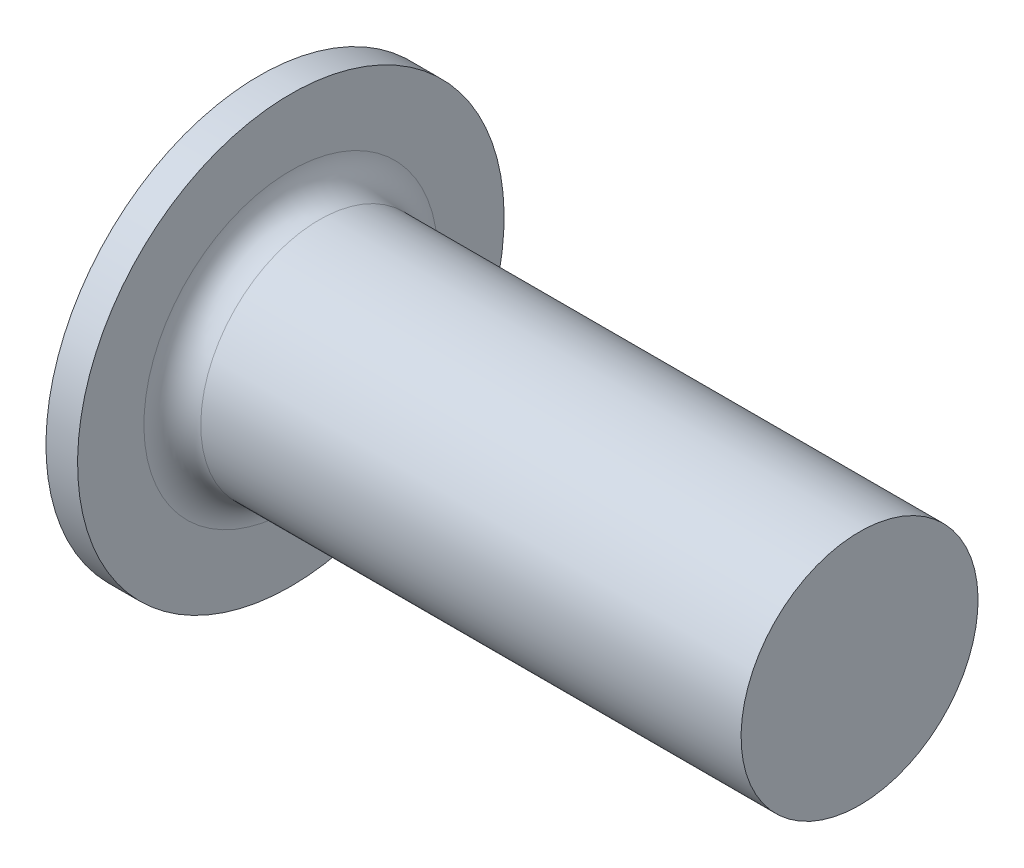
ISO-10303-21;
HEADER;
FILE_DESCRIPTION(('STEP AP214'),'2;1');
FILE_NAME('part.step','',(''),(''),'','','');
FILE_SCHEMA(('AUTOMOTIVE_DESIGN { 1 0 10303 214 1 1 1 1 }'));
ENDSEC;
DATA;
#1=APPLICATION_CONTEXT('core data for automotive mechanical design processes');
#2=APPLICATION_PROTOCOL_DEFINITION('international standard','automotive_design',2000,#1);
#3=PRODUCT_CONTEXT('',#1,'mechanical');
#4=PRODUCT('Part','Part','',(#3));
#5=PRODUCT_RELATED_PRODUCT_CATEGORY('part','',(#4));
#6=PRODUCT_DEFINITION_FORMATION('','',#4);
#7=PRODUCT_DEFINITION_CONTEXT('part definition',#1,'design');
#8=PRODUCT_DEFINITION('design','',#6,#7);
#9=PRODUCT_DEFINITION_SHAPE('','',#8);
#10=(LENGTH_UNIT() NAMED_UNIT(*) SI_UNIT(.MILLI.,.METRE.));
#11=(NAMED_UNIT(*) PLANE_ANGLE_UNIT() SI_UNIT($,.RADIAN.));
#12=(NAMED_UNIT(*) SI_UNIT($,.STERADIAN.) SOLID_ANGLE_UNIT());
#13=UNCERTAINTY_MEASURE_WITH_UNIT(LENGTH_MEASURE(1.E-05),#10,'distance_accuracy_value','');
#14=(GEOMETRIC_REPRESENTATION_CONTEXT(3) GLOBAL_UNCERTAINTY_ASSIGNED_CONTEXT((#13)) GLOBAL_UNIT_ASSIGNED_CONTEXT((#10,
#11,#12)) REPRESENTATION_CONTEXT('',''));
#15=CARTESIAN_POINT('',(0.,0.,0.));
#16=DIRECTION('',(0.,0.,1.));
#17=DIRECTION('',(1.,0.,0.));
#18=AXIS2_PLACEMENT_3D('',#15,#16,#17);
#19=CARTESIAN_POINT('',(-1.,-8.1601392309949E-12,-2.06362704702201E-11));
#20=DIRECTION('',(1.00000000000015,0.,0.));
#21=DIRECTION('',(0.,1.00000000000032,0.));
#22=AXIS2_PLACEMENT_3D('',#19,#20,#21);
#23=PLANE('',#22);
#24=CARTESIAN_POINT('',(-1.,-8.1601392309949E-12,-2.06362704702201E-11));
#25=DIRECTION('',(-1.00000000000015,0.,0.));
#26=DIRECTION('',(0.,-1.00000000000032,0.));
#27=AXIS2_PLACEMENT_3D('',#24,#25,#26);
#28=CIRCLE('',#27,3.92264973081038);
#29=CARTESIAN_POINT('',(-0.999999999999773,-3.92264973081978,-2.0730992069279E-11));
#30=VERTEX_POINT('',#29);
#31=EDGE_CURVE('E246',#30,#30,#28,.T.);
#32=ORIENTED_EDGE('',*,*,#31,.T.);
#33=EDGE_LOOP('',(#32));
#34=FACE_BOUND('',#33,.T.);
#35=CARTESIAN_POINT('',(-1.00000000000219,1.34625624390655,0.777261404798613));
#36=DIRECTION('',(-1.00000000000015,0.,0.));
#37=DIRECTION('',(0.,0.,-1.00000000000033));
#38=AXIS2_PLACEMENT_3D('',#35,#36,#37);
#39=CIRCLE('',#38,0.52952280964857);
#40=CARTESIAN_POINT('',(-0.999999999999945,1.19825813866664,0.268841335585801));
#41=VERTEX_POINT('',#40);
#42=CARTESIAN_POINT('',(-1.00000000000061,0.831952495555288,0.903301320557492));
#43=VERTEX_POINT('',#42);
#44=EDGE_CURVE('E56',#41,#43,#39,.T.);
#45=ORIENTED_EDGE('',*,*,#44,.T.);
#46=CARTESIAN_POINT('',(-1.,0.559999999992344,0.969948452208436));
#47=DIRECTION('',(1.00000000000015,0.,0.));
#48=DIRECTION('',(0.,0.,-1.00000000000033));
#49=AXIS2_PLACEMENT_3D('',#46,#47,#48);
#50=CIRCLE('',#49,0.279999999999998);
#51=CARTESIAN_POINT('',(-1.00000000000297,0.366305643109077,1.17214265615972));
#52=VERTEX_POINT('',#51);
#53=EDGE_CURVE('E170',#43,#52,#50,.T.);
#54=ORIENTED_EDGE('',*,*,#53,.T.);
#55=CARTESIAN_POINT('',(-1.00000000000114,-1.11577413974828E-11,1.55452280962376));
#56=DIRECTION('',(-1.00000000000015,0.,0.));
#57=DIRECTION('',(0.,0.,-1.00000000000033));
#58=AXIS2_PLACEMENT_3D('',#55,#56,#57);
#59=CIRCLE('',#58,0.529522809648569);
#60=CARTESIAN_POINT('',(-1.00000000000158,-0.366305643123954,1.17214265616007));
#61=VERTEX_POINT('',#60);
#62=EDGE_CURVE('E174',#52,#61,#59,.T.);
#63=ORIENTED_EDGE('',*,*,#62,.T.);
#64=CARTESIAN_POINT('',(-0.999999999998613,-0.560000000001393,0.969948452213876));
#65=DIRECTION('',(1.00000000000015,0.,0.));
#66=DIRECTION('',(0.,0.,-1.00000000000033));
#67=AXIS2_PLACEMENT_3D('',#64,#65,#66);
#68=CIRCLE('',#67,0.280000000000001);
#69=CARTESIAN_POINT('',(-0.999999999997031,-0.831952495560784,0.903301320556604));
#70=VERTEX_POINT('',#69);
#71=EDGE_CURVE('E178',#61,#70,#68,.T.);
#72=ORIENTED_EDGE('',*,*,#71,.T.);
#73=CARTESIAN_POINT('',(-1.0000000000033,-1.34625624392515,0.777261404804067));
#74=DIRECTION('',(-1.00000000000015,0.,0.));
#75=DIRECTION('',(0.,0.,-1.00000000000033));
#76=AXIS2_PLACEMENT_3D('',#73,#74,#75);
#77=CIRCLE('',#76,0.529522809648555);
#78=CARTESIAN_POINT('',(-0.999999999999973,-1.19825813868779,0.268841335581929));
#79=VERTEX_POINT('',#78);
#80=EDGE_CURVE('E182',#70,#79,#77,.T.);
#81=ORIENTED_EDGE('',*,*,#80,.T.);
#82=CARTESIAN_POINT('',(-1.00000000000131,-1.1200000000105,-2.35228503342455E-11));
#83=DIRECTION('',(1.00000000000015,0.,0.));
#84=DIRECTION('',(0.,0.,-1.00000000000033));
#85=AXIS2_PLACEMENT_3D('',#82,#83,#84);
#86=CIRCLE('',#85,0.280000000000001);
#87=CARTESIAN_POINT('',(-0.999999999999973,-1.19825813868879,-0.26884133563175));
#88=VERTEX_POINT('',#87);
#89=EDGE_CURVE('E186',#79,#88,#86,.T.);
#90=ORIENTED_EDGE('',*,*,#89,.T.);
#91=CARTESIAN_POINT('',(-0.999999999998447,-1.34625624392826,-0.777261404845242));
#92=DIRECTION('',(-1.00000000000015,0.,0.));
#93=DIRECTION('',(0.,0.,-1.00000000000033));
#94=AXIS2_PLACEMENT_3D('',#91,#92,#93);
#95=CIRCLE('',#94,0.52952280964857);
#96=CARTESIAN_POINT('',(-0.999999999997669,-0.831952495560284,-0.903301320603886));
#97=VERTEX_POINT('',#96);
#98=EDGE_CURVE('E190',#88,#97,#95,.T.);
#99=ORIENTED_EDGE('',*,*,#98,.T.);
#100=CARTESIAN_POINT('',(-1.00000000000081,-0.559999999996896,-0.969948452267819));
#101=DIRECTION('',(1.00000000000015,0.,0.));
#102=DIRECTION('',(0.,0.,-1.00000000000033));
#103=AXIS2_PLACEMENT_3D('',#100,#101,#102);
#104=CIRCLE('',#103,0.279999999999997);
#105=CARTESIAN_POINT('',(-0.999999999997475,-0.366305643114129,-1.17214265621168));
#106=VERTEX_POINT('',#105);
#107=EDGE_CURVE('E194',#97,#106,#104,.T.);
#108=ORIENTED_EDGE('',*,*,#107,.T.);
#109=CARTESIAN_POINT('',(-0.999999999999834,-4.16333634234434E-12,-1.55452280965729));
#110=DIRECTION('',(-1.00000000000015,0.,0.));
#111=DIRECTION('',(0.,0.,-1.00000000000033));
#112=AXIS2_PLACEMENT_3D('',#109,#110,#111);
#113=CIRCLE('',#112,0.529522809648569);
#114=CARTESIAN_POINT('',(-1.00000000000081,0.366305643104081,-1.17214265620667));
#115=VERTEX_POINT('',#114);
#116=EDGE_CURVE('E198',#106,#115,#113,.T.);
#117=ORIENTED_EDGE('',*,*,#116,.T.);
#118=CARTESIAN_POINT('',(-1.00000000000081,0.559999999994787,-0.969948452265931));
#119=DIRECTION('',(1.00000000000015,0.,0.));
#120=DIRECTION('',(0.,0.,-1.00000000000033));
#121=AXIS2_PLACEMENT_3D('',#118,#119,#120);
#122=CIRCLE('',#121,0.28);
#123=CARTESIAN_POINT('',(-1.00000000000081,0.831952495554567,-0.903301320593575));
#124=VERTEX_POINT('',#123);
#125=EDGE_CURVE('E202',#115,#124,#122,.T.);
#126=ORIENTED_EDGE('',*,*,#125,.T.);
#127=CARTESIAN_POINT('',(-0.999999999998863,1.34625624390894,-0.777261404845686));
#128=DIRECTION('',(-1.00000000000015,0.,0.));
#129=DIRECTION('',(0.,0.,-1.00000000000033));
#130=AXIS2_PLACEMENT_3D('',#127,#128,#129);
#131=CIRCLE('',#130,0.529522809648569);
#132=CARTESIAN_POINT('',(-0.999999999999945,1.19825813866897,-0.268841335635095));
#133=VERTEX_POINT('',#132);
#134=EDGE_CURVE('E155',#124,#133,#131,.T.);
#135=ORIENTED_EDGE('',*,*,#134,.T.);
#136=CARTESIAN_POINT('',(-0.999999999999945,1.11999999998991,-2.55212517785708E-11));
#137=DIRECTION('',(1.00000000000015,0.,0.));
#138=DIRECTION('',(0.,0.,-1.00000000000033));
#139=AXIS2_PLACEMENT_3D('',#136,#137,#138);
#140=CIRCLE('',#139,0.28);
#141=EDGE_CURVE('E207',#133,#41,#140,.T.);
#142=ORIENTED_EDGE('',*,*,#141,.T.);
#143=EDGE_LOOP('',(#45,#54,#63,#72,#81,#90,#99,#108,#117,#126,#135,#142));
#144=FACE_BOUND('',#143,.T.);
#145=ADVANCED_FACE('F40',(#34,#144),#23,.F.);
#146=CARTESIAN_POINT('',(-3.1641356201817E-12,4.49999999998896,-2.08583150751451E-11));
#147=DIRECTION('',(-1.00000000000015,0.,0.));
#148=DIRECTION('',(0.,-1.00000000000032,0.));
#149=AXIS2_PLACEMENT_3D('',#146,#147,#148);
#150=PLANE('',#149);
#151=CARTESIAN_POINT('',(0.,0.,0.));
#152=DIRECTION('',(-1.00000000000015,0.,0.));
#153=DIRECTION('',(0.,-1.00000000000032,0.));
#154=AXIS2_PLACEMENT_3D('',#151,#152,#153);
#155=CIRCLE('',#154,3.1);
#156=CARTESIAN_POINT('',(1.79906282495688E-13,-3.10000000000098,0.));
#157=VERTEX_POINT('',#156);
#158=EDGE_CURVE('E49',#157,#157,#155,.T.);
#159=ORIENTED_EDGE('',*,*,#158,.T.);
#160=EDGE_LOOP('',(#159));
#161=FACE_BOUND('',#160,.T.);
#162=CARTESIAN_POINT('',(0.,0.,0.));
#163=DIRECTION('',(-1.00000000000015,0.,0.));
#164=DIRECTION('',(0.,-1.00000000000032,0.));
#165=AXIS2_PLACEMENT_3D('',#162,#163,#164);
#166=CIRCLE('',#165,4.5);
#167=CARTESIAN_POINT('',(2.61154281042128E-13,-4.50000000000143,-1.08663078535187E-13));
#168=VERTEX_POINT('',#167);
#169=EDGE_CURVE('E254',#168,#168,#166,.T.);
#170=ORIENTED_EDGE('',*,*,#169,.F.);
#171=EDGE_LOOP('',(#170));
#172=FACE_BOUND('',#171,.T.);
#173=ADVANCED_FACE('F262',(#161,#172),#150,.F.);
#174=CARTESIAN_POINT('',(-1.,-8.1601392309949E-12,-2.06362704702201E-11));
#175=DIRECTION('',(-1.00000000000015,0.,0.));
#176=DIRECTION('',(0.,-1.00000000000032,0.));
#177=AXIS2_PLACEMENT_3D('',#174,#175,#176);
#178=CYLINDRICAL_SURFACE('',#177,4.5);
#179=CARTESIAN_POINT('',(-0.666666666666649,0.,0.));
#180=DIRECTION('',(-1.00000000000015,0.,0.));
#181=DIRECTION('',(0.,-1.00000000000032,0.));
#182=AXIS2_PLACEMENT_3D('',#179,#180,#181);
#183=CIRCLE('',#182,4.5);
#184=CARTESIAN_POINT('',(-0.666666666666388,-4.50000000000143,-1.08663078535187E-13));
#185=VERTEX_POINT('',#184);
#186=EDGE_CURVE('E250',#185,#185,#183,.T.);
#187=ORIENTED_EDGE('',*,*,#186,.F.);
#188=EDGE_LOOP('',(#187));
#189=FACE_BOUND('',#188,.T.);
#190=ORIENTED_EDGE('',*,*,#169,.T.);
#191=EDGE_LOOP('',(#190));
#192=FACE_BOUND('',#191,.T.);
#193=ADVANCED_FACE('F279',(#189,#192),#178,.T.);
#194=CARTESIAN_POINT('',(-0.666666666666649,0.,0.));
#195=DIRECTION('',(1.00000000000015,0.,0.));
#196=DIRECTION('',(0.,1.00000000000032,0.));
#197=AXIS2_PLACEMENT_3D('',#194,#195,#196);
#198=CONICAL_SURFACE('',#197,4.5,1.0471975511966);
#199=ORIENTED_EDGE('',*,*,#31,.F.);
#200=EDGE_LOOP('',(#199));
#201=FACE_BOUND('',#200,.T.);
#202=ORIENTED_EDGE('',*,*,#186,.T.);
#203=EDGE_LOOP('',(#202));
#204=FACE_BOUND('',#203,.T.);
#205=ADVANCED_FACE('F285',(#201,#204),#198,.T.);
#206=CARTESIAN_POINT('',(12.0000000000054,2.49999999999412,-6.66133814775094E-12));
#207=DIRECTION('',(-1.00000000000015,0.,0.));
#208=DIRECTION('',(0.,-1.00000000000032,0.));
#209=AXIS2_PLACEMENT_3D('',#206,#207,#208);
#210=PLANE('',#209);
#211=CARTESIAN_POINT('',(12.0000000000042,-8.88178419700125E-12,-1.64313007644523E-11));
#212=DIRECTION('',(-1.00000000000015,0.,0.));
#213=DIRECTION('',(0.,-1.00000000000032,0.));
#214=AXIS2_PLACEMENT_3D('',#211,#212,#213);
#215=CIRCLE('',#214,2.5);
#216=CARTESIAN_POINT('',(12.0000000000043,-2.50000000000967,-1.64916691414163E-11));
#217=VERTEX_POINT('',#216);
#218=EDGE_CURVE('E242',#217,#217,#215,.T.);
#219=ORIENTED_EDGE('',*,*,#218,.F.);
#220=EDGE_LOOP('',(#219));
#221=FACE_BOUND('',#220,.T.);
#222=ADVANCED_FACE('F283',(#221),#210,.F.);
#223=CARTESIAN_POINT('',(-1.,-8.1601392309949E-12,-2.06362704702201E-11));
#224=DIRECTION('',(-1.00000000000015,0.,0.));
#225=DIRECTION('',(0.,-1.00000000000032,0.));
#226=AXIS2_PLACEMENT_3D('',#223,#224,#225);
#227=CYLINDRICAL_SURFACE('',#226,2.5);
#228=CARTESIAN_POINT('',(0.599999999999989,-7.16093850883226E-12,-1.65423230669148E-11));
#229=DIRECTION('',(-1.00000000000015,0.,0.));
#230=DIRECTION('',(0.,-1.00000000000032,0.));
#231=AXIS2_PLACEMENT_3D('',#228,#229,#230);
#232=CIRCLE('',#231,2.5);
#233=CARTESIAN_POINT('',(0.600000000000135,-2.50000000000795,-1.66026914438788E-11));
#234=VERTEX_POINT('',#233);
#235=EDGE_CURVE('E11',#234,#234,#232,.F.);
#236=ORIENTED_EDGE('',*,*,#235,.T.);
#237=EDGE_LOOP('',(#236));
#238=FACE_BOUND('',#237,.T.);
#239=ORIENTED_EDGE('',*,*,#218,.T.);
#240=EDGE_LOOP('',(#239));
#241=FACE_BOUND('',#240,.T.);
#242=ADVANCED_FACE('F309',(#238,#241),#227,.T.);
#243=CARTESIAN_POINT('',(-2.19269047363468E-12,1.346256243907,0.777261404799293));
#244=DIRECTION('',(-1.00000000000015,0.,0.));
#245=DIRECTION('',(0.,0.,1.00000000000033));
#246=AXIS2_PLACEMENT_3D('',#243,#244,#245);
#247=CYLINDRICAL_SURFACE('',#246,0.52952280964857);
#248=ORIENTED_EDGE('',*,*,#44,.F.);
#249=DIRECTION('',(-1.00000000000015,0.,0.));
#250=VECTOR('',#249,1.);
#251=CARTESIAN_POINT('',(-6.10622663543836E-13,1.19825813866953,0.26884133559113));
#252=LINE('',#251,#250);
#253=CARTESIAN_POINT('',(-6.10622663543836E-13,1.19825813866953,0.26884133559113));
#254=VERTEX_POINT('',#253);
#255=EDGE_CURVE('E164',#254,#41,#252,.T.);
#256=ORIENTED_EDGE('',*,*,#255,.F.);
#257=CARTESIAN_POINT('',(-2.19269047363468E-12,1.346256243907,0.777261404799293));
#258=DIRECTION('',(-1.00000000000015,0.,0.));
#259=DIRECTION('',(0.,0.,-1.00000000000033));
#260=AXIS2_PLACEMENT_3D('',#257,#258,#259);
#261=CIRCLE('',#260,0.52952280964857);
#262=CARTESIAN_POINT('',(-6.10622663543836E-13,0.831952495556176,0.90330132055827));
#263=VERTEX_POINT('',#262);
#264=EDGE_CURVE('E211',#254,#263,#261,.T.);
#265=ORIENTED_EDGE('',*,*,#264,.T.);
#266=DIRECTION('',(-1.00000000000015,0.,0.));
#267=VECTOR('',#266,1.);
#268=CARTESIAN_POINT('',(-6.10622663543836E-13,0.831952495556176,0.90330132055827));
#269=LINE('',#268,#267);
#270=EDGE_CURVE('E239',#263,#43,#269,.T.);
#271=ORIENTED_EDGE('',*,*,#270,.T.);
#272=EDGE_LOOP('',(#248,#256,#265,#271));
#273=FACE_BOUND('',#272,.T.);
#274=ADVANCED_FACE('F316',(#273),#247,.T.);
#275=CARTESIAN_POINT('',(0.,0.559999999993122,0.969948452212335));
#276=DIRECTION('',(-1.00000000000015,0.,0.));
#277=DIRECTION('',(0.,0.,1.00000000000033));
#278=AXIS2_PLACEMENT_3D('',#275,#276,#277);
#279=CYLINDRICAL_SURFACE('',#278,0.279999999999998);
#280=ORIENTED_EDGE('',*,*,#53,.F.);
#281=ORIENTED_EDGE('',*,*,#270,.F.);
#282=CARTESIAN_POINT('',(0.,0.559999999993122,0.969948452212335));
#283=DIRECTION('',(1.00000000000015,0.,0.));
#284=DIRECTION('',(0.,0.,-1.00000000000033));
#285=AXIS2_PLACEMENT_3D('',#282,#283,#284);
#286=CIRCLE('',#285,0.279999999999998);
#287=CARTESIAN_POINT('',(-2.96984659087229E-12,0.36630564310719,1.17214265616206));
#288=VERTEX_POINT('',#287);
#289=EDGE_CURVE('E113',#263,#288,#286,.T.);
#290=ORIENTED_EDGE('',*,*,#289,.T.);
#291=DIRECTION('',(-1.00000000000015,0.,0.));
#292=VECTOR('',#291,1.);
#293=CARTESIAN_POINT('',(-2.96984659087229E-12,0.36630564310719,1.17214265616206));
#294=LINE('',#293,#292);
#295=EDGE_CURVE('E236',#288,#52,#294,.T.);
#296=ORIENTED_EDGE('',*,*,#295,.T.);
#297=EDGE_LOOP('',(#280,#281,#290,#296));
#298=FACE_BOUND('',#297,.T.);
#299=ADVANCED_FACE('F323',(#298),#279,.F.);
#300=CARTESIAN_POINT('',(-1.13797860024079E-12,-1.14908083048704E-11,1.55452280962454));
#301=DIRECTION('',(-1.00000000000015,0.,0.));
#302=DIRECTION('',(0.,0.,1.00000000000033));
#303=AXIS2_PLACEMENT_3D('',#300,#301,#302);
#304=CYLINDRICAL_SURFACE('',#303,0.529522809648569);
#305=ORIENTED_EDGE('',*,*,#62,.F.);
#306=ORIENTED_EDGE('',*,*,#295,.F.);
#307=CARTESIAN_POINT('',(-1.13797860024079E-12,-1.14908083048704E-11,1.55452280962454));
#308=DIRECTION('',(-1.00000000000015,0.,0.));
#309=DIRECTION('',(0.,0.,-1.00000000000033));
#310=AXIS2_PLACEMENT_3D('',#307,#308,#309);
#311=CIRCLE('',#310,0.529522809648569);
#312=CARTESIAN_POINT('',(-1.58206781009085E-12,-0.366305643122788,1.17214265616183));
#313=VERTEX_POINT('',#312);
#314=EDGE_CURVE('E492',#288,#313,#311,.T.);
#315=ORIENTED_EDGE('',*,*,#314,.T.);
#316=DIRECTION('',(-1.00000000000015,0.,0.));
#317=VECTOR('',#316,1.);
#318=CARTESIAN_POINT('',(-1.58206781009085E-12,-0.366305643122788,1.17214265616183));
#319=LINE('',#318,#317);
#320=EDGE_CURVE('E233',#313,#61,#319,.T.);
#321=ORIENTED_EDGE('',*,*,#320,.T.);
#322=EDGE_LOOP('',(#305,#306,#315,#321));
#323=FACE_BOUND('',#322,.T.);
#324=ADVANCED_FACE('F330',(#323),#304,.T.);
#325=CARTESIAN_POINT('',(1.38777878078145E-12,-0.56000000000106,0.969948452216207));
#326=DIRECTION('',(-1.00000000000015,0.,0.));
#327=DIRECTION('',(0.,0.,1.00000000000033));
#328=AXIS2_PLACEMENT_3D('',#325,#326,#327);
#329=CYLINDRICAL_SURFACE('',#328,0.280000000000001);
#330=ORIENTED_EDGE('',*,*,#71,.F.);
#331=ORIENTED_EDGE('',*,*,#320,.F.);
#332=CARTESIAN_POINT('',(1.38777878078145E-12,-0.56000000000106,0.969948452216207));
#333=DIRECTION('',(1.00000000000015,0.,0.));
#334=DIRECTION('',(0.,0.,-1.00000000000033));
#335=AXIS2_PLACEMENT_3D('',#332,#333,#334);
#336=CIRCLE('',#335,0.280000000000001);
#337=CARTESIAN_POINT('',(2.96984659087229E-12,-0.831952495565058,0.903301320555175));
#338=VERTEX_POINT('',#337);
#339=EDGE_CURVE('E489',#313,#338,#336,.T.);
#340=ORIENTED_EDGE('',*,*,#339,.T.);
#341=DIRECTION('',(-1.00000000000015,0.,0.));
#342=VECTOR('',#341,1.);
#343=CARTESIAN_POINT('',(2.96984659087229E-12,-0.831952495565058,0.903301320555175));
#344=LINE('',#343,#342);
#345=EDGE_CURVE('E230',#338,#70,#344,.T.);
#346=ORIENTED_EDGE('',*,*,#345,.T.);
#347=EDGE_LOOP('',(#330,#331,#340,#346));
#348=FACE_BOUND('',#347,.T.);
#349=ADVANCED_FACE('F338',(#348),#329,.F.);
#350=CARTESIAN_POINT('',(-3.30291349825984E-12,-1.34625624392365,0.777261404798169));
#351=DIRECTION('',(-1.00000000000015,0.,0.));
#352=DIRECTION('',(0.,0.,1.00000000000033));
#353=AXIS2_PLACEMENT_3D('',#350,#351,#352);
#354=CYLINDRICAL_SURFACE('',#353,0.529522809648555);
#355=ORIENTED_EDGE('',*,*,#80,.F.);
#356=ORIENTED_EDGE('',*,*,#345,.F.);
#357=CARTESIAN_POINT('',(-3.30291349825984E-12,-1.34625624392365,0.777261404798169));
#358=DIRECTION('',(-1.00000000000015,0.,0.));
#359=DIRECTION('',(0.,0.,-1.00000000000033));
#360=AXIS2_PLACEMENT_3D('',#357,#358,#359);
#361=CIRCLE('',#360,0.529522809648555);
#362=CARTESIAN_POINT('',(-2.35922392732846E-12,-1.19825813869001,0.268841335581027));
#363=VERTEX_POINT('',#362);
#364=EDGE_CURVE('E486',#338,#363,#361,.T.);
#365=ORIENTED_EDGE('',*,*,#364,.T.);
#366=DIRECTION('',(-1.00000000000015,0.,0.));
#367=VECTOR('',#366,1.);
#368=CARTESIAN_POINT('',(-2.35922392732846E-12,-1.19825813869001,0.268841335581027));
#369=LINE('',#368,#367);
#370=EDGE_CURVE('E227',#363,#79,#369,.T.);
#371=ORIENTED_EDGE('',*,*,#370,.T.);
#372=EDGE_LOOP('',(#355,#356,#365,#371));
#373=FACE_BOUND('',#372,.T.);
#374=ADVANCED_FACE('F346',(#373),#354,.T.);
#375=CARTESIAN_POINT('',(-2.35922392732846E-12,-1.12000000001078,-2.25375273998907E-11));
#376=DIRECTION('',(-1.00000000000015,0.,0.));
#377=DIRECTION('',(0.,0.,1.00000000000033));
#378=AXIS2_PLACEMENT_3D('',#375,#376,#377);
#379=CYLINDRICAL_SURFACE('',#378,0.280000000000001);
#380=ORIENTED_EDGE('',*,*,#89,.F.);
#381=ORIENTED_EDGE('',*,*,#370,.F.);
#382=CARTESIAN_POINT('',(-2.35922392732846E-12,-1.12000000001078,-2.25375273998907E-11));
#383=DIRECTION('',(1.00000000000015,0.,0.));
#384=DIRECTION('',(0.,0.,-1.00000000000033));
#385=AXIS2_PLACEMENT_3D('',#382,#383,#384);
#386=CIRCLE('',#385,0.280000000000001);
#387=CARTESIAN_POINT('',(5.82867087928207E-13,-1.19825813868712,-0.26884133563243));
#388=VERTEX_POINT('',#387);
#389=EDGE_CURVE('E483',#363,#388,#386,.T.);
#390=ORIENTED_EDGE('',*,*,#389,.T.);
#391=DIRECTION('',(-1.00000000000015,0.,0.));
#392=VECTOR('',#391,1.);
#393=CARTESIAN_POINT('',(5.82867087928207E-13,-1.19825813868712,-0.26884133563243));
#394=LINE('',#393,#392);
#395=EDGE_CURVE('E224',#388,#88,#394,.T.);
#396=ORIENTED_EDGE('',*,*,#395,.T.);
#397=EDGE_LOOP('',(#380,#381,#390,#396));
#398=FACE_BOUND('',#397,.T.);
#399=ADVANCED_FACE('F354',(#398),#379,.F.);
#400=CARTESIAN_POINT('',(1.55431223447522E-12,-1.34625624392931,-0.777261404844368));
#401=DIRECTION('',(-1.00000000000015,0.,0.));
#402=DIRECTION('',(0.,0.,1.00000000000033));
#403=AXIS2_PLACEMENT_3D('',#400,#401,#402);
#404=CYLINDRICAL_SURFACE('',#403,0.52952280964857);
#405=ORIENTED_EDGE('',*,*,#98,.F.);
#406=ORIENTED_EDGE('',*,*,#395,.F.);
#407=CARTESIAN_POINT('',(1.55431223447522E-12,-1.34625624392931,-0.777261404844368));
#408=DIRECTION('',(-1.00000000000015,0.,0.));
#409=DIRECTION('',(0.,0.,-1.00000000000033));
#410=AXIS2_PLACEMENT_3D('',#407,#408,#409);
#411=CIRCLE('',#410,0.52952280964857);
#412=CARTESIAN_POINT('',(2.33146835171283E-12,-0.831952495562616,-0.903301320602221));
#413=VERTEX_POINT('',#412);
#414=EDGE_CURVE('E478',#388,#413,#411,.T.);
#415=ORIENTED_EDGE('',*,*,#414,.T.);
#416=DIRECTION('',(-1.00000000000015,0.,0.));
#417=VECTOR('',#416,1.);
#418=CARTESIAN_POINT('',(2.33146835171283E-12,-0.831952495562616,-0.903301320602221));
#419=LINE('',#418,#417);
#420=EDGE_CURVE('E221',#413,#97,#419,.T.);
#421=ORIENTED_EDGE('',*,*,#420,.T.);
#422=EDGE_LOOP('',(#405,#406,#415,#421));
#423=FACE_BOUND('',#422,.T.);
#424=ADVANCED_FACE('F362',(#423),#404,.T.);
#425=CARTESIAN_POINT('',(-8.04911692853238E-13,-0.559999999997507,-0.969948452268721));
#426=DIRECTION('',(-1.00000000000015,0.,0.));
#427=DIRECTION('',(0.,0.,1.00000000000033));
#428=AXIS2_PLACEMENT_3D('',#425,#426,#427);
#429=CYLINDRICAL_SURFACE('',#428,0.279999999999997);
#430=ORIENTED_EDGE('',*,*,#107,.F.);
#431=ORIENTED_EDGE('',*,*,#420,.F.);
#432=CARTESIAN_POINT('',(-8.04911692853238E-13,-0.559999999997507,-0.969948452268721));
#433=DIRECTION('',(1.00000000000015,0.,0.));
#434=DIRECTION('',(0.,0.,-1.00000000000033));
#435=AXIS2_PLACEMENT_3D('',#432,#433,#434);
#436=CIRCLE('',#435,0.279999999999997);
#437=CARTESIAN_POINT('',(2.52575738102223E-12,-0.366305643115294,-1.17214265620856));
#438=VERTEX_POINT('',#437);
#439=EDGE_CURVE('E475',#413,#438,#436,.T.);
#440=ORIENTED_EDGE('',*,*,#439,.T.);
#441=DIRECTION('',(-1.00000000000015,0.,0.));
#442=VECTOR('',#441,1.);
#443=CARTESIAN_POINT('',(2.52575738102223E-12,-0.366305643115294,-1.17214265620856));
#444=LINE('',#443,#442);
#445=EDGE_CURVE('E218',#438,#106,#444,.T.);
#446=ORIENTED_EDGE('',*,*,#445,.T.);
#447=EDGE_LOOP('',(#430,#431,#440,#446));
#448=FACE_BOUND('',#447,.T.);
#449=ADVANCED_FACE('F370',(#448),#429,.F.);
#450=CARTESIAN_POINT('',(1.66533453693773E-13,-4.94049245958195E-12,-1.5545228096675));
#451=DIRECTION('',(-1.00000000000015,0.,0.));
#452=DIRECTION('',(0.,0.,1.00000000000033));
#453=AXIS2_PLACEMENT_3D('',#450,#451,#452);
#454=CYLINDRICAL_SURFACE('',#453,0.529522809648569);
#455=ORIENTED_EDGE('',*,*,#116,.F.);
#456=ORIENTED_EDGE('',*,*,#445,.F.);
#457=CARTESIAN_POINT('',(1.66533453693773E-13,-4.94049245958195E-12,-1.5545228096675));
#458=DIRECTION('',(-1.00000000000015,0.,0.));
#459=DIRECTION('',(0.,0.,-1.00000000000033));
#460=AXIS2_PLACEMENT_3D('',#457,#458,#459);
#461=CIRCLE('',#460,0.529522809648569);
#462=CARTESIAN_POINT('',(-8.04911692853238E-13,0.366305643102693,-1.17214265620724));
#463=VERTEX_POINT('',#462);
#464=EDGE_CURVE('E151',#438,#463,#461,.T.);
#465=ORIENTED_EDGE('',*,*,#464,.T.);
#466=DIRECTION('',(-1.00000000000015,0.,0.));
#467=VECTOR('',#466,1.);
#468=CARTESIAN_POINT('',(-8.04911692853238E-13,0.366305643102693,-1.17214265620724));
#469=LINE('',#468,#467);
#470=EDGE_CURVE('E146',#463,#115,#469,.T.);
#471=ORIENTED_EDGE('',*,*,#470,.T.);
#472=EDGE_LOOP('',(#455,#456,#465,#471));
#473=FACE_BOUND('',#472,.T.);
#474=ADVANCED_FACE('F378',(#473),#454,.T.);
#475=CARTESIAN_POINT('',(-8.04911692853238E-13,0.559999999995175,-0.969948452254843));
#476=DIRECTION('',(-1.00000000000015,0.,0.));
#477=DIRECTION('',(0.,0.,1.00000000000033));
#478=AXIS2_PLACEMENT_3D('',#475,#476,#477);
#479=CYLINDRICAL_SURFACE('',#478,0.28);
#480=ORIENTED_EDGE('',*,*,#125,.F.);
#481=ORIENTED_EDGE('',*,*,#470,.F.);
#482=CARTESIAN_POINT('',(-8.04911692853238E-13,0.559999999995175,-0.969948452254843));
#483=DIRECTION('',(1.00000000000015,0.,0.));
#484=DIRECTION('',(0.,0.,-1.00000000000033));
#485=AXIS2_PLACEMENT_3D('',#482,#483,#484);
#486=CIRCLE('',#485,0.28);
#487=CARTESIAN_POINT('',(-8.04911692853238E-13,0.831952495556454,-0.903301320602554));
#488=VERTEX_POINT('',#487);
#489=EDGE_CURVE('E141',#463,#488,#486,.T.);
#490=ORIENTED_EDGE('',*,*,#489,.T.);
#491=DIRECTION('',(-1.00000000000015,0.,0.));
#492=VECTOR('',#491,1.);
#493=CARTESIAN_POINT('',(-8.04911692853238E-13,0.831952495556454,-0.903301320602554));
#494=LINE('',#493,#492);
#495=EDGE_CURVE('E145',#488,#124,#494,.T.);
#496=ORIENTED_EDGE('',*,*,#495,.T.);
#497=EDGE_LOOP('',(#480,#481,#490,#496));
#498=FACE_BOUND('',#497,.T.);
#499=ADVANCED_FACE('F144',(#498),#479,.F.);
#500=CARTESIAN_POINT('',(1.13797860024079E-12,1.3462562439116,-0.777261404842466));
#501=DIRECTION('',(-1.00000000000015,0.,0.));
#502=DIRECTION('',(0.,0.,1.00000000000033));
#503=AXIS2_PLACEMENT_3D('',#500,#501,#502);
#504=CYLINDRICAL_SURFACE('',#503,0.529522809648569);
#505=ORIENTED_EDGE('',*,*,#134,.F.);
#506=ORIENTED_EDGE('',*,*,#495,.F.);
#507=CARTESIAN_POINT('',(1.13797860024079E-12,1.3462562439116,-0.777261404842466));
#508=DIRECTION('',(-1.00000000000015,0.,0.));
#509=DIRECTION('',(0.,0.,-1.00000000000033));
#510=AXIS2_PLACEMENT_3D('',#507,#508,#509);
#511=CIRCLE('',#510,0.529522809648569);
#512=CARTESIAN_POINT('',(1.66533453693773E-13,1.19825813866803,-0.268841335625755));
#513=VERTEX_POINT('',#512);
#514=EDGE_CURVE('E150',#488,#513,#511,.T.);
#515=ORIENTED_EDGE('',*,*,#514,.T.);
#516=DIRECTION('',(-1.00000000000015,0.,0.));
#517=VECTOR('',#516,1.);
#518=CARTESIAN_POINT('',(1.66533453693773E-13,1.19825813866803,-0.268841335625755));
#519=LINE('',#518,#517);
#520=EDGE_CURVE('E104',#513,#133,#519,.T.);
#521=ORIENTED_EDGE('',*,*,#520,.T.);
#522=EDGE_LOOP('',(#505,#506,#515,#521));
#523=FACE_BOUND('',#522,.T.);
#524=ADVANCED_FACE('F153',(#523),#504,.T.);
#525=CARTESIAN_POINT('',(2.52575738102223E-12,1.11999999999152,-2.75335310107039E-11));
#526=DIRECTION('',(-1.00000000000015,0.,0.));
#527=DIRECTION('',(0.,0.,1.00000000000033));
#528=AXIS2_PLACEMENT_3D('',#525,#526,#527);
#529=CYLINDRICAL_SURFACE('',#528,0.28);
#530=ORIENTED_EDGE('',*,*,#141,.F.);
#531=ORIENTED_EDGE('',*,*,#520,.F.);
#532=CARTESIAN_POINT('',(2.52575738102223E-12,1.11999999999152,-2.75335310107039E-11));
#533=DIRECTION('',(1.00000000000015,0.,0.));
#534=DIRECTION('',(0.,0.,-1.00000000000033));
#535=AXIS2_PLACEMENT_3D('',#532,#533,#534);
#536=CIRCLE('',#535,0.28);
#537=EDGE_CURVE('E64',#513,#254,#536,.T.);
#538=ORIENTED_EDGE('',*,*,#537,.T.);
#539=ORIENTED_EDGE('',*,*,#255,.T.);
#540=EDGE_LOOP('',(#530,#531,#538,#539));
#541=FACE_BOUND('',#540,.T.);
#542=ADVANCED_FACE('F270',(#541),#529,.F.);
#543=CARTESIAN_POINT('',(-6.10622663543836E-13,1.23312812195048,0.388630702392159));
#544=DIRECTION('',(1.00000000000015,0.,0.));
#545=DIRECTION('',(0.,0.,-1.00000000000033));
#546=AXIS2_PLACEMENT_3D('',#543,#544,#545);
#547=PLANE('',#546);
#548=ORIENTED_EDGE('',*,*,#264,.F.);
#549=ORIENTED_EDGE('',*,*,#537,.F.);
#550=ORIENTED_EDGE('',*,*,#514,.F.);
#551=ORIENTED_EDGE('',*,*,#489,.F.);
#552=ORIENTED_EDGE('',*,*,#464,.F.);
#553=ORIENTED_EDGE('',*,*,#439,.F.);
#554=ORIENTED_EDGE('',*,*,#414,.F.);
#555=ORIENTED_EDGE('',*,*,#389,.F.);
#556=ORIENTED_EDGE('',*,*,#364,.F.);
#557=ORIENTED_EDGE('',*,*,#339,.F.);
#558=ORIENTED_EDGE('',*,*,#314,.F.);
#559=ORIENTED_EDGE('',*,*,#289,.F.);
#560=EDGE_LOOP('',(#548,#549,#550,#551,#552,#553,#554,#555,#556,#557,#558,#559));
#561=FACE_BOUND('',#560,.T.);
#562=ADVANCED_FACE('F159',(#561),#547,.F.);
#563=CARTESIAN_POINT('',(0.599999999999989,-7.16093850883226E-12,-1.65423230669148E-11));
#564=DIRECTION('',(-1.00000000000015,0.,0.));
#565=DIRECTION('',(0.,-1.00000000000032,0.));
#566=AXIS2_PLACEMENT_3D('',#563,#564,#565);
#567=TOROIDAL_SURFACE('',#566,3.1,0.6);
#568=ORIENTED_EDGE('',*,*,#235,.F.);
#569=EDGE_LOOP('',(#568));
#570=FACE_BOUND('',#569,.T.);
#571=ORIENTED_EDGE('',*,*,#158,.F.);
#572=EDGE_LOOP('',(#571));
#573=FACE_BOUND('',#572,.T.);
#574=ADVANCED_FACE('F42',(#570,#573),#567,.F.);
#575=CLOSED_SHELL('',(#145,#173,#193,#205,#222,#242,#274,#299,#324,#349,#374,#399,#424,#449,
#474,#499,#524,#542,#562,#574));
#576=MANIFOLD_SOLID_BREP('B2',#575);
#577=ADVANCED_BREP_SHAPE_REPRESENTATION('',(#18,#576),#14);
#578=SHAPE_DEFINITION_REPRESENTATION(#9,#577);
ENDSEC;
END-ISO-10303-21;
